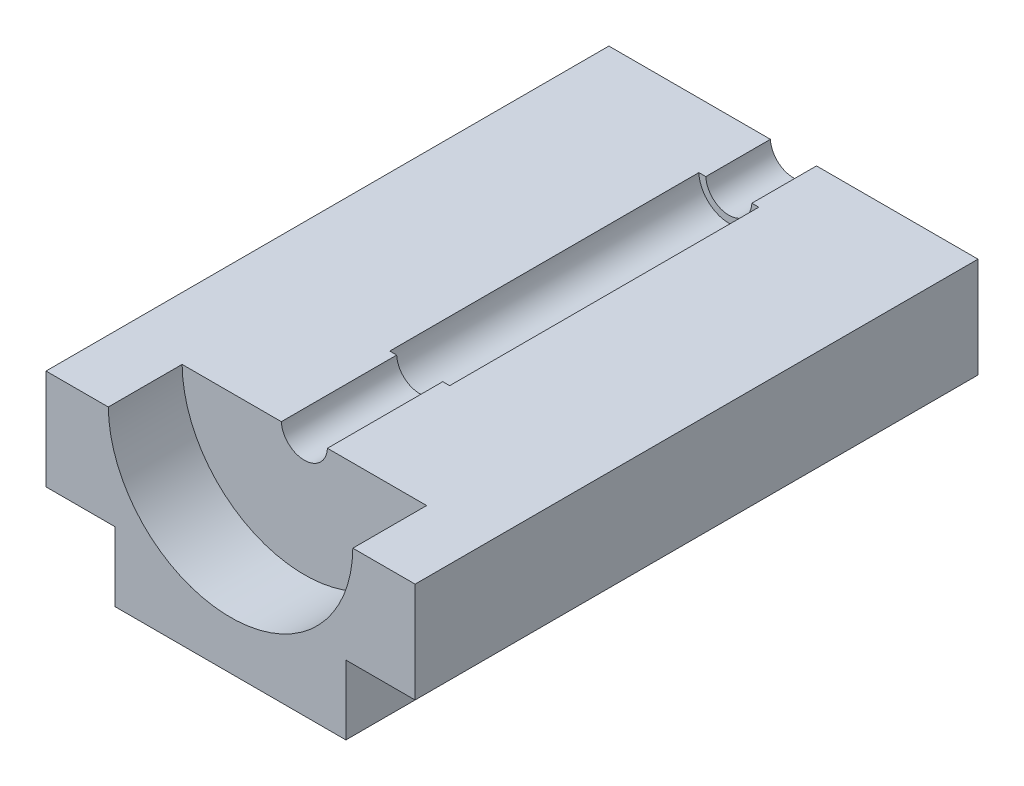
ISO-10303-21;
HEADER;
FILE_DESCRIPTION(('STEP AP214'),'2;1');
FILE_NAME('part.step','',(''),(''),'','','');
FILE_SCHEMA(('AUTOMOTIVE_DESIGN { 1 0 10303 214 1 1 1 1 }'));
ENDSEC;
DATA;
#1=APPLICATION_CONTEXT('core data for automotive mechanical design processes');
#2=APPLICATION_PROTOCOL_DEFINITION('international standard','automotive_design',2000,#1);
#3=PRODUCT_CONTEXT('',#1,'mechanical');
#4=PRODUCT('Part','Part','',(#3));
#5=PRODUCT_RELATED_PRODUCT_CATEGORY('part','',(#4));
#6=PRODUCT_DEFINITION_FORMATION('','',#4);
#7=PRODUCT_DEFINITION_CONTEXT('part definition',#1,'design');
#8=PRODUCT_DEFINITION('design','',#6,#7);
#9=PRODUCT_DEFINITION_SHAPE('','',#8);
#10=(LENGTH_UNIT() NAMED_UNIT(*) SI_UNIT(.MILLI.,.METRE.));
#11=(NAMED_UNIT(*) PLANE_ANGLE_UNIT() SI_UNIT($,.RADIAN.));
#12=(NAMED_UNIT(*) SI_UNIT($,.STERADIAN.) SOLID_ANGLE_UNIT());
#13=UNCERTAINTY_MEASURE_WITH_UNIT(LENGTH_MEASURE(1.E-05),#10,'distance_accuracy_value','');
#14=(GEOMETRIC_REPRESENTATION_CONTEXT(3) GLOBAL_UNCERTAINTY_ASSIGNED_CONTEXT((#13)) GLOBAL_UNIT_ASSIGNED_CONTEXT((#10,
#11,#12)) REPRESENTATION_CONTEXT('',''));
#15=CARTESIAN_POINT('',(0.,0.,0.));
#16=DIRECTION('',(0.,0.,1.));
#17=DIRECTION('',(1.,0.,0.));
#18=AXIS2_PLACEMENT_3D('',#15,#16,#17);
#19=CARTESIAN_POINT('',(0.,-20.,-148.38477631085));
#20=DIRECTION('',(0.,0.,1.));
#21=DIRECTION('',(1.,0.,0.));
#22=AXIS2_PLACEMENT_3D('',#19,#20,#21);
#23=CYLINDRICAL_SURFACE('',#22,6.5);
#24=DIRECTION('',(0.,0.,1.));
#25=VECTOR('',#24,1.);
#26=CARTESIAN_POINT('',(6.4951905283833,-20.25,-148.38477631085));
#27=LINE('',#26,#25);
#28=CARTESIAN_POINT('',(6.4951905283833,-20.25,-116.));
#29=VERTEX_POINT('',#28);
#30=CARTESIAN_POINT('',(6.4951905283833,-20.25,-49.));
#31=VERTEX_POINT('',#30);
#32=EDGE_CURVE('E245',#29,#31,#27,.T.);
#33=ORIENTED_EDGE('',*,*,#32,.F.);
#34=CARTESIAN_POINT('',(0.,-20.,-116.));
#35=DIRECTION('',(0.,0.,-1.));
#36=DIRECTION('',(-1.,0.,0.));
#37=AXIS2_PLACEMENT_3D('',#34,#35,#36);
#38=CIRCLE('',#37,6.5);
#39=CARTESIAN_POINT('',(-6.49519052838327,-20.25,-116.));
#40=VERTEX_POINT('',#39);
#41=EDGE_CURVE('E222',#29,#40,#38,.T.);
#42=ORIENTED_EDGE('',*,*,#41,.T.);
#43=DIRECTION('',(0.,0.,1.));
#44=VECTOR('',#43,1.);
#45=CARTESIAN_POINT('',(-6.49519052838327,-20.25,-148.38477631085));
#46=LINE('',#45,#44);
#47=CARTESIAN_POINT('',(-6.49519052838327,-20.25,-49.));
#48=VERTEX_POINT('',#47);
#49=EDGE_CURVE('E264',#48,#40,#46,.F.);
#50=ORIENTED_EDGE('',*,*,#49,.F.);
#51=CARTESIAN_POINT('',(0.,-20.,-49.));
#52=DIRECTION('',(0.,0.,-1.));
#53=DIRECTION('',(-1.,0.,0.));
#54=AXIS2_PLACEMENT_3D('',#51,#52,#53);
#55=CIRCLE('',#54,6.5);
#56=EDGE_CURVE('E213',#31,#48,#55,.T.);
#57=ORIENTED_EDGE('',*,*,#56,.F.);
#58=EDGE_LOOP('',(#33,#42,#50,#57));
#59=FACE_BOUND('',#58,.T.);
#60=ADVANCED_FACE('F45',(#59),#23,.F.);
#61=CARTESIAN_POINT('',(40.,-57.,-130.));
#62=DIRECTION('',(-1.,0.,0.));
#63=DIRECTION('',(0.,0.,1.));
#64=AXIS2_PLACEMENT_3D('',#61,#62,#63);
#65=PLANE('',#64);
#66=DIRECTION('',(0.,-1.,0.));
#67=VECTOR('',#66,1.);
#68=CARTESIAN_POINT('',(40.,-57.,-8.));
#69=LINE('',#68,#67);
#70=CARTESIAN_POINT('',(40.,-20.25,-8.00000000000004));
#71=VERTEX_POINT('',#70);
#72=CARTESIAN_POINT('',(40.,-42.,-8.));
#73=VERTEX_POINT('',#72);
#74=EDGE_CURVE('E193',#71,#73,#69,.T.);
#75=ORIENTED_EDGE('',*,*,#74,.T.);
#76=DIRECTION('',(0.,0.,-1.));
#77=VECTOR('',#76,1.);
#78=CARTESIAN_POINT('',(40.,-42.,13.2132034355964));
#79=LINE('',#78,#77);
#80=CARTESIAN_POINT('',(40.,-42.,-130.));
#81=VERTEX_POINT('',#80);
#82=EDGE_CURVE('E69',#73,#81,#79,.T.);
#83=ORIENTED_EDGE('',*,*,#82,.T.);
#84=DIRECTION('',(0.,-1.,0.));
#85=VECTOR('',#84,1.);
#86=CARTESIAN_POINT('',(40.,-57.,-130.));
#87=LINE('',#86,#85);
#88=CARTESIAN_POINT('',(40.,-20.25,-130.));
#89=VERTEX_POINT('',#88);
#90=EDGE_CURVE('E189',#89,#81,#87,.T.);
#91=ORIENTED_EDGE('',*,*,#90,.F.);
#92=DIRECTION('',(0.,0.,1.));
#93=VECTOR('',#92,1.);
#94=CARTESIAN_POINT('',(40.,-20.25,-130.));
#95=LINE('',#94,#93);
#96=EDGE_CURVE('E280',#89,#71,#95,.T.);
#97=ORIENTED_EDGE('',*,*,#96,.T.);
#98=EDGE_LOOP('',(#75,#83,#91,#97));
#99=FACE_BOUND('',#98,.T.);
#100=ADVANCED_FACE('F47',(#99),#65,.F.);
#101=CARTESIAN_POINT('',(40.,-57.,-130.));
#102=DIRECTION('',(0.,1.,0.));
#103=DIRECTION('',(0.,0.,1.));
#104=AXIS2_PLACEMENT_3D('',#101,#102,#103);
#105=PLANE('',#104);
#106=DIRECTION('',(-1.,0.,0.));
#107=VECTOR('',#106,1.);
#108=CARTESIAN_POINT('',(40.,-57.,-8.));
#109=LINE('',#108,#107);
#110=CARTESIAN_POINT('',(25.,-57.,-8.));
#111=VERTEX_POINT('',#110);
#112=CARTESIAN_POINT('',(-25.,-57.,-8.));
#113=VERTEX_POINT('',#112);
#114=EDGE_CURVE('E197',#111,#113,#109,.T.);
#115=ORIENTED_EDGE('',*,*,#114,.T.);
#116=DIRECTION('',(0.,0.,-1.));
#117=VECTOR('',#116,1.);
#118=CARTESIAN_POINT('',(-25.,-57.,13.2132034355964));
#119=LINE('',#118,#117);
#120=CARTESIAN_POINT('',(-25.,-57.,-130.));
#121=VERTEX_POINT('',#120);
#122=EDGE_CURVE('E312',#113,#121,#119,.T.);
#123=ORIENTED_EDGE('',*,*,#122,.T.);
#124=DIRECTION('',(-1.,0.,0.));
#125=VECTOR('',#124,1.);
#126=CARTESIAN_POINT('',(40.,-57.,-130.));
#127=LINE('',#126,#125);
#128=CARTESIAN_POINT('',(25.,-57.,-130.));
#129=VERTEX_POINT('',#128);
#130=EDGE_CURVE('E184',#129,#121,#127,.T.);
#131=ORIENTED_EDGE('',*,*,#130,.F.);
#132=DIRECTION('',(0.,0.,-1.));
#133=VECTOR('',#132,1.);
#134=CARTESIAN_POINT('',(25.,-57.,13.2132034355964));
#135=LINE('',#134,#133);
#136=EDGE_CURVE('E293',#111,#129,#135,.T.);
#137=ORIENTED_EDGE('',*,*,#136,.F.);
#138=EDGE_LOOP('',(#115,#123,#131,#137));
#139=FACE_BOUND('',#138,.T.);
#140=ADVANCED_FACE('F354',(#139),#105,.F.);
#141=CARTESIAN_POINT('',(-40.,-57.,-130.));
#142=DIRECTION('',(1.,0.,0.));
#143=DIRECTION('',(0.,1.,0.));
#144=AXIS2_PLACEMENT_3D('',#141,#142,#143);
#145=PLANE('',#144);
#146=DIRECTION('',(0.,1.,0.));
#147=VECTOR('',#146,1.);
#148=CARTESIAN_POINT('',(-40.,-57.,-130.));
#149=LINE('',#148,#147);
#150=CARTESIAN_POINT('',(-40.,-42.,-130.));
#151=VERTEX_POINT('',#150);
#152=CARTESIAN_POINT('',(-40.,-20.25,-130.));
#153=VERTEX_POINT('',#152);
#154=EDGE_CURVE('E173',#151,#153,#149,.T.);
#155=ORIENTED_EDGE('',*,*,#154,.F.);
#156=DIRECTION('',(0.,0.,-1.));
#157=VECTOR('',#156,1.);
#158=CARTESIAN_POINT('',(-40.,-42.,13.2132034355964));
#159=LINE('',#158,#157);
#160=CARTESIAN_POINT('',(-40.,-42.,-8.));
#161=VERTEX_POINT('',#160);
#162=EDGE_CURVE('E157',#161,#151,#159,.T.);
#163=ORIENTED_EDGE('',*,*,#162,.F.);
#164=DIRECTION('',(0.,1.,0.));
#165=VECTOR('',#164,1.);
#166=CARTESIAN_POINT('',(-40.,-57.,-8.));
#167=LINE('',#166,#165);
#168=CARTESIAN_POINT('',(-40.,-20.25,-8.));
#169=VERTEX_POINT('',#168);
#170=EDGE_CURVE('E201',#161,#169,#167,.T.);
#171=ORIENTED_EDGE('',*,*,#170,.T.);
#172=DIRECTION('',(0.,0.,1.));
#173=VECTOR('',#172,1.);
#174=CARTESIAN_POINT('',(-40.,-20.25,-130.));
#175=LINE('',#174,#173);
#176=EDGE_CURVE('E182',#153,#169,#175,.T.);
#177=ORIENTED_EDGE('',*,*,#176,.F.);
#178=EDGE_LOOP('',(#155,#163,#171,#177));
#179=FACE_BOUND('',#178,.T.);
#180=ADVANCED_FACE('F180',(#179),#145,.F.);
#181=CARTESIAN_POINT('',(0.,0.,-130.));
#182=DIRECTION('',(0.,0.,-1.));
#183=DIRECTION('',(-1.,0.,0.));
#184=AXIS2_PLACEMENT_3D('',#181,#182,#183);
#185=PLANE('',#184);
#186=DIRECTION('',(0.,-1.,0.));
#187=VECTOR('',#186,1.);
#188=CARTESIAN_POINT('',(-25.,-42.,-130.));
#189=LINE('',#188,#187);
#190=CARTESIAN_POINT('',(-25.,-42.,-130.));
#191=VERTEX_POINT('',#190);
#192=EDGE_CURVE('E168',#191,#121,#189,.T.);
#193=ORIENTED_EDGE('',*,*,#192,.F.);
#194=DIRECTION('',(1.,0.,0.));
#195=VECTOR('',#194,1.);
#196=CARTESIAN_POINT('',(-40.,-42.,-130.));
#197=LINE('',#196,#195);
#198=EDGE_CURVE('E160',#151,#191,#197,.T.);
#199=ORIENTED_EDGE('',*,*,#198,.F.);
#200=ORIENTED_EDGE('',*,*,#154,.T.);
#201=DIRECTION('',(1.,0.,0.));
#202=VECTOR('',#201,1.);
#203=CARTESIAN_POINT('',(-40.,-20.25,-130.));
#204=LINE('',#203,#202);
#205=CARTESIAN_POINT('',(-4.99374608885953,-20.25,-130.));
#206=VERTEX_POINT('',#205);
#207=EDGE_CURVE('E283',#153,#206,#204,.T.);
#208=ORIENTED_EDGE('',*,*,#207,.T.);
#209=CARTESIAN_POINT('',(0.,-20.,-130.));
#210=DIRECTION('',(0.,0.,-1.));
#211=DIRECTION('',(-1.,0.,0.));
#212=AXIS2_PLACEMENT_3D('',#209,#210,#211);
#213=CIRCLE('',#212,5.);
#214=CARTESIAN_POINT('',(4.99374608885956,-20.25,-130.));
#215=VERTEX_POINT('',#214);
#216=EDGE_CURVE('E229',#215,#206,#213,.T.);
#217=ORIENTED_EDGE('',*,*,#216,.F.);
#218=EDGE_CURVE('E289',#215,#89,#204,.T.);
#219=ORIENTED_EDGE('',*,*,#218,.T.);
#220=ORIENTED_EDGE('',*,*,#90,.T.);
#221=DIRECTION('',(1.,0.,0.));
#222=VECTOR('',#221,1.);
#223=CARTESIAN_POINT('',(40.,-42.,-130.));
#224=LINE('',#223,#222);
#225=CARTESIAN_POINT('',(25.,-42.,-130.));
#226=VERTEX_POINT('',#225);
#227=EDGE_CURVE('E298',#226,#81,#224,.T.);
#228=ORIENTED_EDGE('',*,*,#227,.F.);
#229=DIRECTION('',(0.,1.,0.));
#230=VECTOR('',#229,1.);
#231=CARTESIAN_POINT('',(25.,-42.,-130.));
#232=LINE('',#231,#230);
#233=EDGE_CURVE('E177',#129,#226,#232,.T.);
#234=ORIENTED_EDGE('',*,*,#233,.F.);
#235=ORIENTED_EDGE('',*,*,#130,.T.);
#236=EDGE_LOOP('',(#193,#199,#200,#208,#217,#219,#220,#228,#234,#235));
#237=FACE_BOUND('',#236,.T.);
#238=ADVANCED_FACE('F171',(#237),#185,.T.);
#239=CARTESIAN_POINT('',(0.,-20.,-24.));
#240=DIRECTION('',(0.,0.,1.));
#241=DIRECTION('',(1.,0.,0.));
#242=AXIS2_PLACEMENT_3D('',#239,#240,#241);
#243=CYLINDRICAL_SURFACE('',#242,26.5);
#244=DIRECTION('',(0.,0.,1.));
#245=VECTOR('',#244,1.);
#246=CARTESIAN_POINT('',(26.4988207284777,-20.25,-24.));
#247=LINE('',#246,#245);
#248=CARTESIAN_POINT('',(26.4988207284777,-20.25,-24.));
#249=VERTEX_POINT('',#248);
#250=CARTESIAN_POINT('',(26.4988207284777,-20.25,-8.));
#251=VERTEX_POINT('',#250);
#252=EDGE_CURVE('E253',#249,#251,#247,.T.);
#253=ORIENTED_EDGE('',*,*,#252,.F.);
#254=CARTESIAN_POINT('',(0.,-20.,-24.));
#255=DIRECTION('',(0.,0.,-1.));
#256=DIRECTION('',(-1.,0.,0.));
#257=AXIS2_PLACEMENT_3D('',#254,#255,#256);
#258=CIRCLE('',#257,26.5);
#259=CARTESIAN_POINT('',(-26.4988207284777,-20.25,-24.));
#260=VERTEX_POINT('',#259);
#261=EDGE_CURVE('E198',#249,#260,#258,.T.);
#262=ORIENTED_EDGE('',*,*,#261,.T.);
#263=DIRECTION('',(0.,0.,1.));
#264=VECTOR('',#263,1.);
#265=CARTESIAN_POINT('',(-26.4988207284777,-20.25,-24.));
#266=LINE('',#265,#264);
#267=CARTESIAN_POINT('',(-26.4988207284777,-20.25,-8.));
#268=VERTEX_POINT('',#267);
#269=EDGE_CURVE('E277',#268,#260,#266,.F.);
#270=ORIENTED_EDGE('',*,*,#269,.F.);
#271=CARTESIAN_POINT('',(0.,-20.,-8.));
#272=DIRECTION('',(0.,0.,-1.));
#273=DIRECTION('',(-1.,0.,0.));
#274=AXIS2_PLACEMENT_3D('',#271,#272,#273);
#275=CIRCLE('',#274,26.5);
#276=EDGE_CURVE('E209',#251,#268,#275,.T.);
#277=ORIENTED_EDGE('',*,*,#276,.F.);
#278=EDGE_LOOP('',(#253,#262,#270,#277));
#279=FACE_BOUND('',#278,.T.);
#280=ADVANCED_FACE('F361',(#279),#243,.F.);
#281=CARTESIAN_POINT('',(0.,-20.,-24.));
#282=DIRECTION('',(0.,0.,-1.));
#283=DIRECTION('',(-1.,0.,0.));
#284=AXIS2_PLACEMENT_3D('',#281,#282,#283);
#285=PLANE('',#284);
#286=ORIENTED_EDGE('',*,*,#261,.F.);
#287=DIRECTION('',(-1.,0.,0.));
#288=VECTOR('',#287,1.);
#289=CARTESIAN_POINT('',(0.,-20.25,-24.));
#290=LINE('',#289,#288);
#291=CARTESIAN_POINT('',(4.99374608885956,-20.25,-24.));
#292=VERTEX_POINT('',#291);
#293=EDGE_CURVE('E252',#249,#292,#290,.T.);
#294=ORIENTED_EDGE('',*,*,#293,.T.);
#295=CARTESIAN_POINT('',(0.,-20.,-24.));
#296=DIRECTION('',(0.,0.,-1.));
#297=DIRECTION('',(-1.,0.,0.));
#298=AXIS2_PLACEMENT_3D('',#295,#296,#297);
#299=CIRCLE('',#298,5.);
#300=CARTESIAN_POINT('',(-4.99374608885953,-20.25,-24.));
#301=VERTEX_POINT('',#300);
#302=EDGE_CURVE('E217',#292,#301,#299,.T.);
#303=ORIENTED_EDGE('',*,*,#302,.T.);
#304=EDGE_CURVE('E273',#301,#260,#290,.T.);
#305=ORIENTED_EDGE('',*,*,#304,.T.);
#306=EDGE_LOOP('',(#286,#294,#303,#305));
#307=FACE_BOUND('',#306,.T.);
#308=ADVANCED_FACE('F364',(#307),#285,.F.);
#309=CARTESIAN_POINT('',(0.,-20.,-49.));
#310=DIRECTION('',(0.,0.,1.));
#311=DIRECTION('',(1.,0.,0.));
#312=AXIS2_PLACEMENT_3D('',#309,#310,#311);
#313=CYLINDRICAL_SURFACE('',#312,5.);
#314=DIRECTION('',(0.,0.,1.));
#315=VECTOR('',#314,1.);
#316=CARTESIAN_POINT('',(4.99374608885956,-20.25,-49.));
#317=LINE('',#316,#315);
#318=CARTESIAN_POINT('',(4.99374608885956,-20.25,-49.));
#319=VERTEX_POINT('',#318);
#320=EDGE_CURVE('E249',#319,#292,#317,.T.);
#321=ORIENTED_EDGE('',*,*,#320,.F.);
#322=CARTESIAN_POINT('',(0.,-20.,-49.));
#323=DIRECTION('',(0.,0.,-1.));
#324=DIRECTION('',(-1.,0.,0.));
#325=AXIS2_PLACEMENT_3D('',#322,#323,#324);
#326=CIRCLE('',#325,5.);
#327=CARTESIAN_POINT('',(-4.99374608885953,-20.25,-49.));
#328=VERTEX_POINT('',#327);
#329=EDGE_CURVE('E221',#319,#328,#326,.T.);
#330=ORIENTED_EDGE('',*,*,#329,.T.);
#331=DIRECTION('',(0.,0.,1.));
#332=VECTOR('',#331,1.);
#333=CARTESIAN_POINT('',(-4.99374608885953,-20.25,-49.));
#334=LINE('',#333,#332);
#335=EDGE_CURVE('E270',#301,#328,#334,.F.);
#336=ORIENTED_EDGE('',*,*,#335,.F.);
#337=ORIENTED_EDGE('',*,*,#302,.F.);
#338=EDGE_LOOP('',(#321,#330,#336,#337));
#339=FACE_BOUND('',#338,.T.);
#340=ADVANCED_FACE('F370',(#339),#313,.F.);
#341=CARTESIAN_POINT('',(0.,-20.,-49.));
#342=DIRECTION('',(0.,0.,-1.));
#343=DIRECTION('',(-1.,0.,0.));
#344=AXIS2_PLACEMENT_3D('',#341,#342,#343);
#345=PLANE('',#344);
#346=DIRECTION('',(-1.,0.,0.));
#347=VECTOR('',#346,1.);
#348=CARTESIAN_POINT('',(0.,-20.25,-49.));
#349=LINE('',#348,#347);
#350=EDGE_CURVE('E248',#31,#319,#349,.T.);
#351=ORIENTED_EDGE('',*,*,#350,.F.);
#352=ORIENTED_EDGE('',*,*,#56,.T.);
#353=EDGE_CURVE('E267',#328,#48,#349,.T.);
#354=ORIENTED_EDGE('',*,*,#353,.F.);
#355=ORIENTED_EDGE('',*,*,#329,.F.);
#356=EDGE_LOOP('',(#351,#352,#354,#355));
#357=FACE_BOUND('',#356,.T.);
#358=ADVANCED_FACE('F374',(#357),#345,.T.);
#359=CARTESIAN_POINT('',(0.,-20.,-116.));
#360=DIRECTION('',(0.,0.,-1.));
#361=DIRECTION('',(-1.,0.,0.));
#362=AXIS2_PLACEMENT_3D('',#359,#360,#361);
#363=CYLINDRICAL_SURFACE('',#362,5.);
#364=ORIENTED_EDGE('',*,*,#216,.T.);
#365=DIRECTION('',(0.,0.,-1.));
#366=VECTOR('',#365,1.);
#367=CARTESIAN_POINT('',(-4.99374608885953,-20.25,-116.));
#368=LINE('',#367,#366);
#369=CARTESIAN_POINT('',(-4.99374608885953,-20.25,-116.));
#370=VERTEX_POINT('',#369);
#371=EDGE_CURVE('E256',#206,#370,#368,.F.);
#372=ORIENTED_EDGE('',*,*,#371,.T.);
#373=CARTESIAN_POINT('',(0.,-20.,-116.));
#374=DIRECTION('',(0.,0.,-1.));
#375=DIRECTION('',(-1.,0.,0.));
#376=AXIS2_PLACEMENT_3D('',#373,#374,#375);
#377=CIRCLE('',#376,5.);
#378=CARTESIAN_POINT('',(4.99374608885956,-20.25,-116.));
#379=VERTEX_POINT('',#378);
#380=EDGE_CURVE('E233',#379,#370,#377,.T.);
#381=ORIENTED_EDGE('',*,*,#380,.F.);
#382=DIRECTION('',(0.,0.,-1.));
#383=VECTOR('',#382,1.);
#384=CARTESIAN_POINT('',(4.99374608885956,-20.25,-116.));
#385=LINE('',#384,#383);
#386=EDGE_CURVE('E234',#379,#215,#385,.T.);
#387=ORIENTED_EDGE('',*,*,#386,.T.);
#388=EDGE_LOOP('',(#364,#372,#381,#387));
#389=FACE_BOUND('',#388,.T.);
#390=ADVANCED_FACE('F335',(#389),#363,.F.);
#391=CARTESIAN_POINT('',(0.,-20.,-116.));
#392=DIRECTION('',(0.,0.,-1.));
#393=DIRECTION('',(-1.,0.,0.));
#394=AXIS2_PLACEMENT_3D('',#391,#392,#393);
#395=PLANE('',#394);
#396=ORIENTED_EDGE('',*,*,#41,.F.);
#397=DIRECTION('',(-1.,0.,0.));
#398=VECTOR('',#397,1.);
#399=CARTESIAN_POINT('',(0.,-20.25,-116.));
#400=LINE('',#399,#398);
#401=EDGE_CURVE('E244',#29,#379,#400,.T.);
#402=ORIENTED_EDGE('',*,*,#401,.T.);
#403=ORIENTED_EDGE('',*,*,#380,.T.);
#404=EDGE_CURVE('E260',#370,#40,#400,.T.);
#405=ORIENTED_EDGE('',*,*,#404,.T.);
#406=EDGE_LOOP('',(#396,#402,#403,#405));
#407=FACE_BOUND('',#406,.T.);
#408=ADVANCED_FACE('F331',(#407),#395,.F.);
#409=CARTESIAN_POINT('',(-52.5,35.,-8.));
#410=DIRECTION('',(0.,0.,-1.));
#411=DIRECTION('',(-1.,0.,0.));
#412=AXIS2_PLACEMENT_3D('',#409,#410,#411);
#413=PLANE('',#412);
#414=DIRECTION('',(-1.,0.,0.));
#415=VECTOR('',#414,1.);
#416=CARTESIAN_POINT('',(-40.,-42.,-8.));
#417=LINE('',#416,#415);
#418=CARTESIAN_POINT('',(-25.,-42.,-8.));
#419=VERTEX_POINT('',#418);
#420=EDGE_CURVE('E163',#419,#161,#417,.T.);
#421=ORIENTED_EDGE('',*,*,#420,.F.);
#422=DIRECTION('',(0.,1.,0.));
#423=VECTOR('',#422,1.);
#424=CARTESIAN_POINT('',(-25.,-42.,-8.));
#425=LINE('',#424,#423);
#426=EDGE_CURVE('E318',#113,#419,#425,.T.);
#427=ORIENTED_EDGE('',*,*,#426,.F.);
#428=ORIENTED_EDGE('',*,*,#114,.F.);
#429=DIRECTION('',(0.,-1.,0.));
#430=VECTOR('',#429,1.);
#431=CARTESIAN_POINT('',(25.,-42.,-8.));
#432=LINE('',#431,#430);
#433=CARTESIAN_POINT('',(25.,-42.,-8.));
#434=VERTEX_POINT('',#433);
#435=EDGE_CURVE('E290',#434,#111,#432,.T.);
#436=ORIENTED_EDGE('',*,*,#435,.F.);
#437=DIRECTION('',(-1.,0.,0.));
#438=VECTOR('',#437,1.);
#439=CARTESIAN_POINT('',(40.,-42.,-8.));
#440=LINE('',#439,#438);
#441=EDGE_CURVE('E294',#73,#434,#440,.T.);
#442=ORIENTED_EDGE('',*,*,#441,.F.);
#443=ORIENTED_EDGE('',*,*,#74,.F.);
#444=DIRECTION('',(-1.,0.,0.));
#445=VECTOR('',#444,1.);
#446=CARTESIAN_POINT('',(-52.5,-20.25,-8.));
#447=LINE('',#446,#445);
#448=EDGE_CURVE('E11',#71,#251,#447,.T.);
#449=ORIENTED_EDGE('',*,*,#448,.T.);
#450=ORIENTED_EDGE('',*,*,#276,.T.);
#451=EDGE_CURVE('E49',#268,#169,#447,.T.);
#452=ORIENTED_EDGE('',*,*,#451,.T.);
#453=ORIENTED_EDGE('',*,*,#170,.F.);
#454=EDGE_LOOP('',(#421,#427,#428,#436,#442,#443,#449,#450,#452,#453));
#455=FACE_BOUND('',#454,.T.);
#456=ADVANCED_FACE('F342',(#455),#413,.F.);
#457=CARTESIAN_POINT('',(-40.,-20.25,-130.));
#458=DIRECTION('',(0.,-1.,0.));
#459=DIRECTION('',(0.,0.,-1.));
#460=AXIS2_PLACEMENT_3D('',#457,#458,#459);
#461=PLANE('',#460);
#462=ORIENTED_EDGE('',*,*,#207,.F.);
#463=ORIENTED_EDGE('',*,*,#176,.T.);
#464=ORIENTED_EDGE('',*,*,#451,.F.);
#465=ORIENTED_EDGE('',*,*,#269,.T.);
#466=ORIENTED_EDGE('',*,*,#304,.F.);
#467=ORIENTED_EDGE('',*,*,#335,.T.);
#468=ORIENTED_EDGE('',*,*,#353,.T.);
#469=ORIENTED_EDGE('',*,*,#49,.T.);
#470=ORIENTED_EDGE('',*,*,#404,.F.);
#471=ORIENTED_EDGE('',*,*,#371,.F.);
#472=EDGE_LOOP('',(#462,#463,#464,#465,#466,#467,#468,#469,#470,#471));
#473=FACE_BOUND('',#472,.T.);
#474=ADVANCED_FACE('F338',(#473),#461,.F.);
#475=ORIENTED_EDGE('',*,*,#401,.F.);
#476=ORIENTED_EDGE('',*,*,#32,.T.);
#477=ORIENTED_EDGE('',*,*,#350,.T.);
#478=ORIENTED_EDGE('',*,*,#320,.T.);
#479=ORIENTED_EDGE('',*,*,#293,.F.);
#480=ORIENTED_EDGE('',*,*,#252,.T.);
#481=ORIENTED_EDGE('',*,*,#448,.F.);
#482=ORIENTED_EDGE('',*,*,#96,.F.);
#483=ORIENTED_EDGE('',*,*,#218,.F.);
#484=ORIENTED_EDGE('',*,*,#386,.F.);
#485=EDGE_LOOP('',(#475,#476,#477,#478,#479,#480,#481,#482,#483,#484));
#486=FACE_BOUND('',#485,.T.);
#487=ADVANCED_FACE('F378',(#486),#461,.F.);
#488=CARTESIAN_POINT('',(25.,-42.,13.2132034355964));
#489=DIRECTION('',(-1.,0.,0.));
#490=DIRECTION('',(0.,-1.,0.));
#491=AXIS2_PLACEMENT_3D('',#488,#489,#490);
#492=PLANE('',#491);
#493=ORIENTED_EDGE('',*,*,#435,.T.);
#494=ORIENTED_EDGE('',*,*,#136,.T.);
#495=ORIENTED_EDGE('',*,*,#233,.T.);
#496=DIRECTION('',(0.,0.,-1.));
#497=VECTOR('',#496,1.);
#498=CARTESIAN_POINT('',(25.,-42.,13.2132034355964));
#499=LINE('',#498,#497);
#500=EDGE_CURVE('E301',#434,#226,#499,.T.);
#501=ORIENTED_EDGE('',*,*,#500,.F.);
#502=EDGE_LOOP('',(#493,#494,#495,#501));
#503=FACE_BOUND('',#502,.T.);
#504=ADVANCED_FACE('F349',(#503),#492,.F.);
#505=CARTESIAN_POINT('',(40.,-42.,13.2132034355964));
#506=DIRECTION('',(0.,1.,0.));
#507=DIRECTION('',(0.,0.,1.));
#508=AXIS2_PLACEMENT_3D('',#505,#506,#507);
#509=PLANE('',#508);
#510=ORIENTED_EDGE('',*,*,#441,.T.);
#511=ORIENTED_EDGE('',*,*,#500,.T.);
#512=ORIENTED_EDGE('',*,*,#227,.T.);
#513=ORIENTED_EDGE('',*,*,#82,.F.);
#514=EDGE_LOOP('',(#510,#511,#512,#513));
#515=FACE_BOUND('',#514,.T.);
#516=ADVANCED_FACE('F347',(#515),#509,.F.);
#517=CARTESIAN_POINT('',(-25.,-42.,13.2132034355964));
#518=DIRECTION('',(1.,0.,0.));
#519=DIRECTION('',(0.,1.,0.));
#520=AXIS2_PLACEMENT_3D('',#517,#518,#519);
#521=PLANE('',#520);
#522=ORIENTED_EDGE('',*,*,#426,.T.);
#523=DIRECTION('',(0.,0.,-1.));
#524=VECTOR('',#523,1.);
#525=CARTESIAN_POINT('',(-25.,-42.,13.2132034355964));
#526=LINE('',#525,#524);
#527=EDGE_CURVE('E61',#419,#191,#526,.T.);
#528=ORIENTED_EDGE('',*,*,#527,.T.);
#529=ORIENTED_EDGE('',*,*,#192,.T.);
#530=ORIENTED_EDGE('',*,*,#122,.F.);
#531=EDGE_LOOP('',(#522,#528,#529,#530));
#532=FACE_BOUND('',#531,.T.);
#533=ADVANCED_FACE('F357',(#532),#521,.F.);
#534=CARTESIAN_POINT('',(-40.,-42.,13.2132034355964));
#535=DIRECTION('',(0.,1.,0.));
#536=DIRECTION('',(0.,0.,1.));
#537=AXIS2_PLACEMENT_3D('',#534,#535,#536);
#538=PLANE('',#537);
#539=ORIENTED_EDGE('',*,*,#420,.T.);
#540=ORIENTED_EDGE('',*,*,#162,.T.);
#541=ORIENTED_EDGE('',*,*,#198,.T.);
#542=ORIENTED_EDGE('',*,*,#527,.F.);
#543=EDGE_LOOP('',(#539,#540,#541,#542));
#544=FACE_BOUND('',#543,.T.);
#545=ADVANCED_FACE('F159',(#544),#538,.F.);
#546=CLOSED_SHELL('',(#60,#100,#140,#180,#238,#280,#308,#340,#358,#390,#408,#456,#474,#487,#504,
#516,#533,#545));
#547=MANIFOLD_SOLID_BREP('B2',#546);
#548=ADVANCED_BREP_SHAPE_REPRESENTATION('',(#18,#547),#14);
#549=SHAPE_DEFINITION_REPRESENTATION(#9,#548);
ENDSEC;
END-ISO-10303-21;
